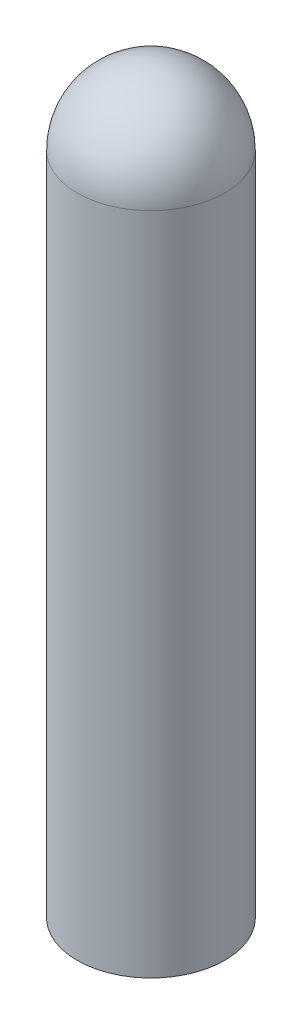
ISO-10303-21;
HEADER;
FILE_DESCRIPTION(('STEP AP214'),'2;1');
FILE_NAME('part.step','',(''),(''),'','','');
FILE_SCHEMA(('AUTOMOTIVE_DESIGN { 1 0 10303 214 1 1 1 1 }'));
ENDSEC;
DATA;
#1=APPLICATION_CONTEXT('core data for automotive mechanical design processes');
#2=APPLICATION_PROTOCOL_DEFINITION('international standard','automotive_design',2000,#1);
#3=PRODUCT_CONTEXT('',#1,'mechanical');
#4=PRODUCT('Part','Part','',(#3));
#5=PRODUCT_RELATED_PRODUCT_CATEGORY('part','',(#4));
#6=PRODUCT_DEFINITION_FORMATION('','',#4);
#7=PRODUCT_DEFINITION_CONTEXT('part definition',#1,'design');
#8=PRODUCT_DEFINITION('design','',#6,#7);
#9=PRODUCT_DEFINITION_SHAPE('','',#8);
#10=(LENGTH_UNIT() NAMED_UNIT(*) SI_UNIT(.MILLI.,.METRE.));
#11=(NAMED_UNIT(*) PLANE_ANGLE_UNIT() SI_UNIT($,.RADIAN.));
#12=(NAMED_UNIT(*) SI_UNIT($,.STERADIAN.) SOLID_ANGLE_UNIT());
#13=UNCERTAINTY_MEASURE_WITH_UNIT(LENGTH_MEASURE(1.E-05),#10,'distance_accuracy_value','');
#14=(GEOMETRIC_REPRESENTATION_CONTEXT(3) GLOBAL_UNCERTAINTY_ASSIGNED_CONTEXT((#13)) GLOBAL_UNIT_ASSIGNED_CONTEXT((#10,
#11,#12)) REPRESENTATION_CONTEXT('',''));
#15=CARTESIAN_POINT('',(0.,0.,0.));
#16=DIRECTION('',(0.,0.,1.));
#17=DIRECTION('',(1.,0.,0.));
#18=AXIS2_PLACEMENT_3D('',#15,#16,#17);
#19=CARTESIAN_POINT('',(-2.55000000000001,0.,2.55000000000001));
#20=DIRECTION('',(0.,-1.,0.));
#21=DIRECTION('',(0.,0.,-1.));
#22=AXIS2_PLACEMENT_3D('',#19,#20,#21);
#23=PLANE('',#22);
#24=CARTESIAN_POINT('',(0.,0.,0.));
#25=DIRECTION('',(0.,1.,0.));
#26=DIRECTION('',(0.,0.,1.));
#27=AXIS2_PLACEMENT_3D('',#24,#25,#26);
#28=CIRCLE('',#27,2.54);
#29=CARTESIAN_POINT('',(0.,0.,2.54));
#30=VERTEX_POINT('',#29);
#31=EDGE_CURVE('E19',#30,#30,#28,.T.);
#32=ORIENTED_EDGE('',*,*,#31,.F.);
#33=EDGE_LOOP('',(#32));
#34=FACE_BOUND('',#33,.T.);
#35=ADVANCED_FACE('F15',(#34),#23,.T.);
#36=CARTESIAN_POINT('',(0.,0.,0.));
#37=DIRECTION('',(0.,1.,0.));
#38=DIRECTION('',(0.,0.,1.));
#39=AXIS2_PLACEMENT_3D('',#36,#37,#38);
#40=CYLINDRICAL_SURFACE('',#39,2.54);
#41=CARTESIAN_POINT('',(0.,22.86,0.));
#42=DIRECTION('',(0.,1.,0.));
#43=DIRECTION('',(0.,0.,1.));
#44=AXIS2_PLACEMENT_3D('',#41,#42,#43);
#45=CIRCLE('',#44,2.54);
#46=CARTESIAN_POINT('',(0.,22.86,2.54));
#47=VERTEX_POINT('',#46);
#48=EDGE_CURVE('E10',#47,#47,#45,.T.);
#49=ORIENTED_EDGE('',*,*,#48,.F.);
#50=EDGE_LOOP('',(#49));
#51=FACE_BOUND('',#50,.T.);
#52=ORIENTED_EDGE('',*,*,#31,.T.);
#53=EDGE_LOOP('',(#52));
#54=FACE_BOUND('',#53,.T.);
#55=ADVANCED_FACE('F28',(#51,#54),#40,.T.);
#56=CARTESIAN_POINT('',(0.,22.86,0.));
#57=DIRECTION('',(0.,1.,0.));
#58=DIRECTION('',(0.,0.,1.));
#59=AXIS2_PLACEMENT_3D('',#56,#57,#58);
#60=SPHERICAL_SURFACE('',#59,2.54);
#61=ORIENTED_EDGE('',*,*,#48,.T.);
#62=EDGE_LOOP('',(#61));
#63=FACE_BOUND('',#62,.T.);
#64=ADVANCED_FACE('F17',(#63),#60,.T.);
#65=CLOSED_SHELL('',(#35,#55,#64));
#66=MANIFOLD_SOLID_BREP('B1',#65);
#67=ADVANCED_BREP_SHAPE_REPRESENTATION('',(#18,#66),#14);
#68=SHAPE_DEFINITION_REPRESENTATION(#9,#67);
ENDSEC;
END-ISO-10303-21;
